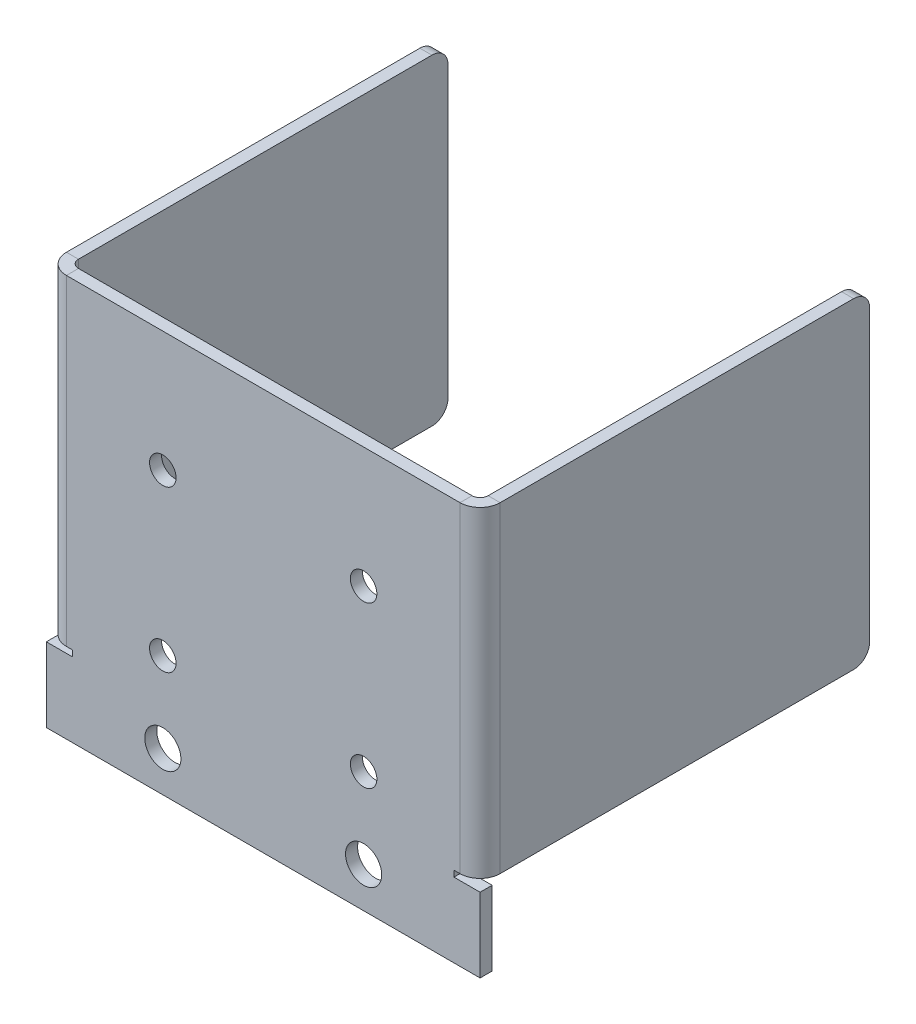
ISO-10303-21;
HEADER;
FILE_DESCRIPTION(('STEP AP214'),'2;1');
FILE_NAME('part.step','',(''),(''),'','','');
FILE_SCHEMA(('AUTOMOTIVE_DESIGN { 1 0 10303 214 1 1 1 1 }'));
ENDSEC;
DATA;
#1=APPLICATION_CONTEXT('core data for automotive mechanical design processes');
#2=APPLICATION_PROTOCOL_DEFINITION('international standard','automotive_design',2000,#1);
#3=PRODUCT_CONTEXT('',#1,'mechanical');
#4=PRODUCT('Part','Part','',(#3));
#5=PRODUCT_RELATED_PRODUCT_CATEGORY('part','',(#4));
#6=PRODUCT_DEFINITION_FORMATION('','',#4);
#7=PRODUCT_DEFINITION_CONTEXT('part definition',#1,'design');
#8=PRODUCT_DEFINITION('design','',#6,#7);
#9=PRODUCT_DEFINITION_SHAPE('','',#8);
#10=(LENGTH_UNIT() NAMED_UNIT(*) SI_UNIT(.MILLI.,.METRE.));
#11=(NAMED_UNIT(*) PLANE_ANGLE_UNIT() SI_UNIT($,.RADIAN.));
#12=(NAMED_UNIT(*) SI_UNIT($,.STERADIAN.) SOLID_ANGLE_UNIT());
#13=UNCERTAINTY_MEASURE_WITH_UNIT(LENGTH_MEASURE(1.E-05),#10,'distance_accuracy_value','');
#14=(GEOMETRIC_REPRESENTATION_CONTEXT(3) GLOBAL_UNCERTAINTY_ASSIGNED_CONTEXT((#13)) GLOBAL_UNIT_ASSIGNED_CONTEXT((#10,
#11,#12)) REPRESENTATION_CONTEXT('',''));
#15=CARTESIAN_POINT('',(0.,0.,0.));
#16=DIRECTION('',(0.,0.,1.));
#17=DIRECTION('',(1.,0.,0.));
#18=AXIS2_PLACEMENT_3D('',#15,#16,#17);
#19=CARTESIAN_POINT('',(0.,0.,0.));
#20=DIRECTION('',(0.,0.,-1.));
#21=DIRECTION('',(-1.,0.,0.));
#22=AXIS2_PLACEMENT_3D('',#19,#20,#21);
#23=PLANE('',#22);
#24=CARTESIAN_POINT('',(-12.5,-20.,0.));
#25=DIRECTION('',(0.,0.,1.));
#26=DIRECTION('',(1.,0.,0.));
#27=AXIS2_PLACEMENT_3D('',#24,#25,#26);
#28=CIRCLE('',#27,2.24999999999999);
#29=CARTESIAN_POINT('',(-10.25,-20.,0.));
#30=VERTEX_POINT('',#29);
#31=EDGE_CURVE('E487',#30,#30,#28,.T.);
#32=ORIENTED_EDGE('',*,*,#31,.F.);
#33=EDGE_LOOP('',(#32));
#34=FACE_BOUND('',#33,.T.);
#35=CARTESIAN_POINT('',(12.5,-20.,0.));
#36=DIRECTION('',(0.,0.,1.));
#37=DIRECTION('',(1.,0.,0.));
#38=AXIS2_PLACEMENT_3D('',#35,#36,#37);
#39=CIRCLE('',#38,2.24999999999999);
#40=CARTESIAN_POINT('',(14.75,-20.,0.));
#41=VERTEX_POINT('',#40);
#42=EDGE_CURVE('E481',#41,#41,#39,.T.);
#43=ORIENTED_EDGE('',*,*,#42,.F.);
#44=EDGE_LOOP('',(#43));
#45=FACE_BOUND('',#44,.T.);
#46=DIRECTION('',(0.,1.,0.));
#47=VECTOR('',#46,1.);
#48=CARTESIAN_POINT('',(-24.5,25.,0.));
#49=LINE('',#48,#47);
#50=CARTESIAN_POINT('',(-24.5,25.,0.));
#51=VERTEX_POINT('',#50);
#52=CARTESIAN_POINT('',(-24.5,-15.,0.));
#53=VERTEX_POINT('',#52);
#54=EDGE_CURVE('E262',#51,#53,#49,.F.);
#55=ORIENTED_EDGE('',*,*,#54,.T.);
#56=DIRECTION('',(-1.,0.,0.));
#57=VECTOR('',#56,1.);
#58=CARTESIAN_POINT('',(0.,-15.,0.));
#59=LINE('',#58,#57);
#60=CARTESIAN_POINT('',(-23.75,-15.,0.));
#61=VERTEX_POINT('',#60);
#62=EDGE_CURVE('E426',#61,#53,#59,.T.);
#63=ORIENTED_EDGE('',*,*,#62,.F.);
#64=DIRECTION('',(0.,1.,0.));
#65=VECTOR('',#64,1.);
#66=CARTESIAN_POINT('',(-23.75,0.,0.));
#67=LINE('',#66,#65);
#68=CARTESIAN_POINT('',(-23.75,-15.75,0.));
#69=VERTEX_POINT('',#68);
#70=EDGE_CURVE('E424',#69,#61,#67,.T.);
#71=ORIENTED_EDGE('',*,*,#70,.F.);
#72=DIRECTION('',(1.,0.,0.));
#73=VECTOR('',#72,1.);
#74=CARTESIAN_POINT('',(0.,-15.75,0.));
#75=LINE('',#74,#73);
#76=CARTESIAN_POINT('',(-27.,-15.75,0.));
#77=VERTEX_POINT('',#76);
#78=EDGE_CURVE('E358',#77,#69,#75,.T.);
#79=ORIENTED_EDGE('',*,*,#78,.F.);
#80=DIRECTION('',(0.,-1.,0.));
#81=VECTOR('',#80,1.);
#82=CARTESIAN_POINT('',(-27.,-25.,0.));
#83=LINE('',#82,#81);
#84=CARTESIAN_POINT('',(-27.,-25.,0.));
#85=VERTEX_POINT('',#84);
#86=EDGE_CURVE('E407',#77,#85,#83,.T.);
#87=ORIENTED_EDGE('',*,*,#86,.T.);
#88=DIRECTION('',(1.,0.,0.));
#89=VECTOR('',#88,1.);
#90=CARTESIAN_POINT('',(-27.,-25.,0.));
#91=LINE('',#90,#89);
#92=CARTESIAN_POINT('',(27.,-25.,0.));
#93=VERTEX_POINT('',#92);
#94=EDGE_CURVE('E394',#85,#93,#91,.T.);
#95=ORIENTED_EDGE('',*,*,#94,.T.);
#96=DIRECTION('',(0.,1.,0.));
#97=VECTOR('',#96,1.);
#98=CARTESIAN_POINT('',(27.,-25.,0.));
#99=LINE('',#98,#97);
#100=CARTESIAN_POINT('',(27.,-15.75,0.));
#101=VERTEX_POINT('',#100);
#102=EDGE_CURVE('E376',#93,#101,#99,.T.);
#103=ORIENTED_EDGE('',*,*,#102,.T.);
#104=DIRECTION('',(1.,0.,0.));
#105=VECTOR('',#104,1.);
#106=CARTESIAN_POINT('',(0.,-15.75,0.));
#107=LINE('',#106,#105);
#108=CARTESIAN_POINT('',(23.75,-15.75,0.));
#109=VERTEX_POINT('',#108);
#110=EDGE_CURVE('E421',#109,#101,#107,.T.);
#111=ORIENTED_EDGE('',*,*,#110,.F.);
#112=DIRECTION('',(0.,-1.,0.));
#113=VECTOR('',#112,1.);
#114=CARTESIAN_POINT('',(23.75,0.,0.));
#115=LINE('',#114,#113);
#116=CARTESIAN_POINT('',(23.75,-15.,0.));
#117=VERTEX_POINT('',#116);
#118=EDGE_CURVE('E418',#117,#109,#115,.T.);
#119=ORIENTED_EDGE('',*,*,#118,.F.);
#120=DIRECTION('',(-1.,0.,0.));
#121=VECTOR('',#120,1.);
#122=CARTESIAN_POINT('',(0.,-15.,0.));
#123=LINE('',#122,#121);
#124=CARTESIAN_POINT('',(24.5,-15.,0.));
#125=VERTEX_POINT('',#124);
#126=EDGE_CURVE('E413',#125,#117,#123,.T.);
#127=ORIENTED_EDGE('',*,*,#126,.F.);
#128=DIRECTION('',(0.,-1.,0.));
#129=VECTOR('',#128,1.);
#130=CARTESIAN_POINT('',(24.5,-15.,0.));
#131=LINE('',#130,#129);
#132=CARTESIAN_POINT('',(24.5,25.,0.));
#133=VERTEX_POINT('',#132);
#134=EDGE_CURVE('E333',#125,#133,#131,.F.);
#135=ORIENTED_EDGE('',*,*,#134,.T.);
#136=DIRECTION('',(-1.,0.,0.));
#137=VECTOR('',#136,1.);
#138=CARTESIAN_POINT('',(-27.,25.,0.));
#139=LINE('',#138,#137);
#140=EDGE_CURVE('E405',#133,#51,#139,.T.);
#141=ORIENTED_EDGE('',*,*,#140,.T.);
#142=EDGE_LOOP('',(#55,#63,#71,#79,#87,#95,#103,#111,#119,#127,#135,#141));
#143=FACE_BOUND('',#142,.T.);
#144=CARTESIAN_POINT('',(-12.5,10.,0.));
#145=DIRECTION('',(0.,0.,-1.));
#146=DIRECTION('',(-1.,0.,0.));
#147=AXIS2_PLACEMENT_3D('',#144,#145,#146);
#148=CIRCLE('',#147,1.65);
#149=CARTESIAN_POINT('',(-14.15,10.,0.));
#150=VERTEX_POINT('',#149);
#151=EDGE_CURVE('E490',#150,#150,#148,.T.);
#152=ORIENTED_EDGE('',*,*,#151,.T.);
#153=EDGE_LOOP('',(#152));
#154=FACE_BOUND('',#153,.T.);
#155=CARTESIAN_POINT('',(12.5,10.,0.));
#156=DIRECTION('',(0.,0.,-1.));
#157=DIRECTION('',(-1.,0.,0.));
#158=AXIS2_PLACEMENT_3D('',#155,#156,#157);
#159=CIRCLE('',#158,1.65);
#160=CARTESIAN_POINT('',(10.85,10.,0.));
#161=VERTEX_POINT('',#160);
#162=EDGE_CURVE('E496',#161,#161,#159,.T.);
#163=ORIENTED_EDGE('',*,*,#162,.T.);
#164=EDGE_LOOP('',(#163));
#165=FACE_BOUND('',#164,.T.);
#166=CARTESIAN_POINT('',(12.5,-9.99999999999999,0.));
#167=DIRECTION('',(0.,0.,1.));
#168=DIRECTION('',(1.,0.,0.));
#169=AXIS2_PLACEMENT_3D('',#166,#167,#168);
#170=CIRCLE('',#169,1.64999999999999);
#171=CARTESIAN_POINT('',(14.15,-9.99999999999999,0.));
#172=VERTEX_POINT('',#171);
#173=EDGE_CURVE('E505',#172,#172,#170,.T.);
#174=ORIENTED_EDGE('',*,*,#173,.F.);
#175=EDGE_LOOP('',(#174));
#176=FACE_BOUND('',#175,.T.);
#177=CARTESIAN_POINT('',(-12.5,-9.99999999999999,0.));
#178=DIRECTION('',(0.,0.,1.));
#179=DIRECTION('',(1.,0.,0.));
#180=AXIS2_PLACEMENT_3D('',#177,#178,#179);
#181=CIRCLE('',#180,1.64999999999999);
#182=CARTESIAN_POINT('',(-10.85,-9.99999999999999,0.));
#183=VERTEX_POINT('',#182);
#184=EDGE_CURVE('E511',#183,#183,#181,.T.);
#185=ORIENTED_EDGE('',*,*,#184,.F.);
#186=EDGE_LOOP('',(#185));
#187=FACE_BOUND('',#186,.T.);
#188=ADVANCED_FACE('F85',(#34,#45,#143,#154,#165,#176,#187),#23,.F.);
#189=CARTESIAN_POINT('',(0.,0.,-1.5));
#190=DIRECTION('',(0.,0.,-1.));
#191=DIRECTION('',(-1.,0.,0.));
#192=AXIS2_PLACEMENT_3D('',#189,#190,#191);
#193=PLANE('',#192);
#194=CARTESIAN_POINT('',(-12.5,-9.99999999999999,-1.5));
#195=DIRECTION('',(0.,0.,-1.));
#196=DIRECTION('',(-1.,0.,0.));
#197=AXIS2_PLACEMENT_3D('',#194,#195,#196);
#198=CIRCLE('',#197,1.64999999999999);
#199=CARTESIAN_POINT('',(-14.15,-9.99999999999999,-1.5));
#200=VERTEX_POINT('',#199);
#201=EDGE_CURVE('E508',#200,#200,#198,.T.);
#202=ORIENTED_EDGE('',*,*,#201,.F.);
#203=EDGE_LOOP('',(#202));
#204=FACE_BOUND('',#203,.T.);
#205=CARTESIAN_POINT('',(12.5,-9.99999999999999,-1.5));
#206=DIRECTION('',(0.,0.,-1.));
#207=DIRECTION('',(-1.,0.,0.));
#208=AXIS2_PLACEMENT_3D('',#205,#206,#207);
#209=CIRCLE('',#208,1.64999999999999);
#210=CARTESIAN_POINT('',(10.85,-9.99999999999999,-1.5));
#211=VERTEX_POINT('',#210);
#212=EDGE_CURVE('E502',#211,#211,#209,.T.);
#213=ORIENTED_EDGE('',*,*,#212,.F.);
#214=EDGE_LOOP('',(#213));
#215=FACE_BOUND('',#214,.T.);
#216=CARTESIAN_POINT('',(12.5,10.,-1.5));
#217=DIRECTION('',(0.,0.,-1.));
#218=DIRECTION('',(-1.,0.,0.));
#219=AXIS2_PLACEMENT_3D('',#216,#217,#218);
#220=CIRCLE('',#219,1.64999999999999);
#221=CARTESIAN_POINT('',(10.85,10.,-1.5));
#222=VERTEX_POINT('',#221);
#223=EDGE_CURVE('E499',#222,#222,#220,.T.);
#224=ORIENTED_EDGE('',*,*,#223,.F.);
#225=EDGE_LOOP('',(#224));
#226=FACE_BOUND('',#225,.T.);
#227=CARTESIAN_POINT('',(-12.5,10.,-1.5));
#228=DIRECTION('',(0.,0.,-1.));
#229=DIRECTION('',(-1.,0.,0.));
#230=AXIS2_PLACEMENT_3D('',#227,#228,#229);
#231=CIRCLE('',#230,1.64999999999999);
#232=CARTESIAN_POINT('',(-14.15,10.,-1.5));
#233=VERTEX_POINT('',#232);
#234=EDGE_CURVE('E493',#233,#233,#231,.T.);
#235=ORIENTED_EDGE('',*,*,#234,.F.);
#236=EDGE_LOOP('',(#235));
#237=FACE_BOUND('',#236,.T.);
#238=CARTESIAN_POINT('',(-12.5,-20.,-1.5));
#239=DIRECTION('',(0.,0.,-1.));
#240=DIRECTION('',(-1.,0.,0.));
#241=AXIS2_PLACEMENT_3D('',#238,#239,#240);
#242=CIRCLE('',#241,2.24999999999999);
#243=CARTESIAN_POINT('',(-14.75,-20.,-1.5));
#244=VERTEX_POINT('',#243);
#245=EDGE_CURVE('E484',#244,#244,#242,.T.);
#246=ORIENTED_EDGE('',*,*,#245,.F.);
#247=EDGE_LOOP('',(#246));
#248=FACE_BOUND('',#247,.T.);
#249=CARTESIAN_POINT('',(12.5,-20.,-1.5));
#250=DIRECTION('',(0.,0.,-1.));
#251=DIRECTION('',(-1.,0.,0.));
#252=AXIS2_PLACEMENT_3D('',#249,#250,#251);
#253=CIRCLE('',#252,2.24999999999999);
#254=CARTESIAN_POINT('',(10.25,-20.,-1.5));
#255=VERTEX_POINT('',#254);
#256=EDGE_CURVE('E288',#255,#255,#253,.T.);
#257=ORIENTED_EDGE('',*,*,#256,.F.);
#258=EDGE_LOOP('',(#257));
#259=FACE_BOUND('',#258,.T.);
#260=DIRECTION('',(1.,0.,0.));
#261=VECTOR('',#260,1.);
#262=CARTESIAN_POINT('',(-24.5,-15.,-1.5));
#263=LINE('',#262,#261);
#264=CARTESIAN_POINT('',(-24.5,-15.,-1.5));
#265=VERTEX_POINT('',#264);
#266=CARTESIAN_POINT('',(-23.75,-15.,-1.5));
#267=VERTEX_POINT('',#266);
#268=EDGE_CURVE('E355',#265,#267,#263,.T.);
#269=ORIENTED_EDGE('',*,*,#268,.F.);
#270=DIRECTION('',(0.,1.,0.));
#271=VECTOR('',#270,1.);
#272=CARTESIAN_POINT('',(-24.5,25.,-1.5));
#273=LINE('',#272,#271);
#274=CARTESIAN_POINT('',(-24.5,25.,-1.5));
#275=VERTEX_POINT('',#274);
#276=EDGE_CURVE('E295',#275,#265,#273,.F.);
#277=ORIENTED_EDGE('',*,*,#276,.F.);
#278=DIRECTION('',(-1.,0.,0.));
#279=VECTOR('',#278,1.);
#280=CARTESIAN_POINT('',(-27.,25.,-1.5));
#281=LINE('',#280,#279);
#282=CARTESIAN_POINT('',(24.5,25.,-1.5));
#283=VERTEX_POINT('',#282);
#284=EDGE_CURVE('E393',#283,#275,#281,.T.);
#285=ORIENTED_EDGE('',*,*,#284,.F.);
#286=DIRECTION('',(0.,-1.,0.));
#287=VECTOR('',#286,1.);
#288=CARTESIAN_POINT('',(24.5,-15.,-1.5));
#289=LINE('',#288,#287);
#290=CARTESIAN_POINT('',(24.5,-15.,-1.5));
#291=VERTEX_POINT('',#290);
#292=EDGE_CURVE('E345',#291,#283,#289,.F.);
#293=ORIENTED_EDGE('',*,*,#292,.F.);
#294=DIRECTION('',(1.,0.,0.));
#295=VECTOR('',#294,1.);
#296=CARTESIAN_POINT('',(23.75,-15.,-1.5));
#297=LINE('',#296,#295);
#298=CARTESIAN_POINT('',(23.75,-15.,-1.5));
#299=VERTEX_POINT('',#298);
#300=EDGE_CURVE('E382',#299,#291,#297,.T.);
#301=ORIENTED_EDGE('',*,*,#300,.F.);
#302=DIRECTION('',(0.,1.,0.));
#303=VECTOR('',#302,1.);
#304=CARTESIAN_POINT('',(23.75,-15.75,-1.5));
#305=LINE('',#304,#303);
#306=CARTESIAN_POINT('',(23.75,-15.75,-1.5));
#307=VERTEX_POINT('',#306);
#308=EDGE_CURVE('E378',#307,#299,#305,.T.);
#309=ORIENTED_EDGE('',*,*,#308,.F.);
#310=DIRECTION('',(-1.,0.,0.));
#311=VECTOR('',#310,1.);
#312=CARTESIAN_POINT('',(27.,-15.75,-1.5));
#313=LINE('',#312,#311);
#314=CARTESIAN_POINT('',(27.,-15.75,-1.5));
#315=VERTEX_POINT('',#314);
#316=EDGE_CURVE('E373',#315,#307,#313,.T.);
#317=ORIENTED_EDGE('',*,*,#316,.F.);
#318=DIRECTION('',(0.,1.,0.));
#319=VECTOR('',#318,1.);
#320=CARTESIAN_POINT('',(27.,-25.,-1.5));
#321=LINE('',#320,#319);
#322=CARTESIAN_POINT('',(27.,-25.,-1.5));
#323=VERTEX_POINT('',#322);
#324=EDGE_CURVE('E390',#323,#315,#321,.T.);
#325=ORIENTED_EDGE('',*,*,#324,.F.);
#326=DIRECTION('',(1.,0.,0.));
#327=VECTOR('',#326,1.);
#328=CARTESIAN_POINT('',(-27.,-25.,-1.5));
#329=LINE('',#328,#327);
#330=CARTESIAN_POINT('',(-27.,-25.,-1.5));
#331=VERTEX_POINT('',#330);
#332=EDGE_CURVE('E399',#331,#323,#329,.T.);
#333=ORIENTED_EDGE('',*,*,#332,.F.);
#334=DIRECTION('',(0.,-1.,0.));
#335=VECTOR('',#334,1.);
#336=CARTESIAN_POINT('',(-27.,-25.,-1.5));
#337=LINE('',#336,#335);
#338=CARTESIAN_POINT('',(-27.,-15.75,-1.5));
#339=VERTEX_POINT('',#338);
#340=EDGE_CURVE('E397',#339,#331,#337,.T.);
#341=ORIENTED_EDGE('',*,*,#340,.F.);
#342=DIRECTION('',(-1.,0.,0.));
#343=VECTOR('',#342,1.);
#344=CARTESIAN_POINT('',(-23.75,-15.75,-1.5));
#345=LINE('',#344,#343);
#346=CARTESIAN_POINT('',(-23.75,-15.75,-1.5));
#347=VERTEX_POINT('',#346);
#348=EDGE_CURVE('E363',#347,#339,#345,.T.);
#349=ORIENTED_EDGE('',*,*,#348,.F.);
#350=DIRECTION('',(0.,-1.,0.));
#351=VECTOR('',#350,1.);
#352=CARTESIAN_POINT('',(-23.75,-15.,-1.5));
#353=LINE('',#352,#351);
#354=EDGE_CURVE('E359',#267,#347,#353,.T.);
#355=ORIENTED_EDGE('',*,*,#354,.F.);
#356=EDGE_LOOP('',(#269,#277,#285,#293,#301,#309,#317,#325,#333,#341,#349,#355));
#357=FACE_BOUND('',#356,.T.);
#358=ADVANCED_FACE('F519',(#204,#215,#226,#237,#248,#259,#357),#193,.T.);
#359=CARTESIAN_POINT('',(-27.,-25.,-1.5));
#360=DIRECTION('',(-1.,0.,0.));
#361=DIRECTION('',(0.,0.,1.));
#362=AXIS2_PLACEMENT_3D('',#359,#360,#361);
#363=PLANE('',#362);
#364=ORIENTED_EDGE('',*,*,#86,.F.);
#365=DIRECTION('',(0.,0.,1.));
#366=VECTOR('',#365,1.);
#367=CARTESIAN_POINT('',(-27.,-15.75,-1.5));
#368=LINE('',#367,#366);
#369=EDGE_CURVE('E365',#339,#77,#368,.T.);
#370=ORIENTED_EDGE('',*,*,#369,.F.);
#371=ORIENTED_EDGE('',*,*,#340,.T.);
#372=DIRECTION('',(0.,0.,1.));
#373=VECTOR('',#372,1.);
#374=CARTESIAN_POINT('',(-27.,-25.,-1.5));
#375=LINE('',#374,#373);
#376=EDGE_CURVE('E402',#331,#85,#375,.T.);
#377=ORIENTED_EDGE('',*,*,#376,.T.);
#378=EDGE_LOOP('',(#364,#370,#371,#377));
#379=FACE_BOUND('',#378,.T.);
#380=ADVANCED_FACE('F525',(#379),#363,.T.);
#381=CARTESIAN_POINT('',(-27.,25.,-1.5));
#382=DIRECTION('',(0.,1.,0.));
#383=DIRECTION('',(0.,0.,1.));
#384=AXIS2_PLACEMENT_3D('',#381,#382,#383);
#385=PLANE('',#384);
#386=ORIENTED_EDGE('',*,*,#284,.T.);
#387=DIRECTION('',(0.,0.,1.));
#388=VECTOR('',#387,1.);
#389=CARTESIAN_POINT('',(-24.5,25.,-1.5));
#390=LINE('',#389,#388);
#391=EDGE_CURVE('E291',#275,#51,#390,.T.);
#392=ORIENTED_EDGE('',*,*,#391,.T.);
#393=ORIENTED_EDGE('',*,*,#140,.F.);
#394=DIRECTION('',(0.,0.,1.));
#395=VECTOR('',#394,1.);
#396=CARTESIAN_POINT('',(24.5,25.,-1.5));
#397=LINE('',#396,#395);
#398=EDGE_CURVE('E350',#283,#133,#397,.T.);
#399=ORIENTED_EDGE('',*,*,#398,.F.);
#400=EDGE_LOOP('',(#386,#392,#393,#399));
#401=FACE_BOUND('',#400,.T.);
#402=ADVANCED_FACE('F540',(#401),#385,.T.);
#403=CARTESIAN_POINT('',(27.,-25.,-1.5));
#404=DIRECTION('',(1.,0.,0.));
#405=DIRECTION('',(0.,0.,-1.));
#406=AXIS2_PLACEMENT_3D('',#403,#404,#405);
#407=PLANE('',#406);
#408=ORIENTED_EDGE('',*,*,#324,.T.);
#409=DIRECTION('',(0.,0.,1.));
#410=VECTOR('',#409,1.);
#411=CARTESIAN_POINT('',(27.,-15.75,-1.5));
#412=LINE('',#411,#410);
#413=EDGE_CURVE('E377',#315,#101,#412,.T.);
#414=ORIENTED_EDGE('',*,*,#413,.T.);
#415=ORIENTED_EDGE('',*,*,#102,.F.);
#416=DIRECTION('',(0.,0.,1.));
#417=VECTOR('',#416,1.);
#418=CARTESIAN_POINT('',(27.,-25.,-1.5));
#419=LINE('',#418,#417);
#420=EDGE_CURVE('E411',#323,#93,#419,.T.);
#421=ORIENTED_EDGE('',*,*,#420,.F.);
#422=EDGE_LOOP('',(#408,#414,#415,#421));
#423=FACE_BOUND('',#422,.T.);
#424=ADVANCED_FACE('F536',(#423),#407,.T.);
#425=CARTESIAN_POINT('',(-27.,-25.,-1.5));
#426=DIRECTION('',(0.,-1.,0.));
#427=DIRECTION('',(0.,0.,-1.));
#428=AXIS2_PLACEMENT_3D('',#425,#426,#427);
#429=PLANE('',#428);
#430=ORIENTED_EDGE('',*,*,#94,.F.);
#431=ORIENTED_EDGE('',*,*,#376,.F.);
#432=ORIENTED_EDGE('',*,*,#332,.T.);
#433=ORIENTED_EDGE('',*,*,#420,.T.);
#434=EDGE_LOOP('',(#430,#431,#432,#433));
#435=FACE_BOUND('',#434,.T.);
#436=ADVANCED_FACE('F532',(#435),#429,.T.);
#437=CARTESIAN_POINT('',(27.,-15.75,-1.5));
#438=DIRECTION('',(0.,1.,0.));
#439=DIRECTION('',(0.,0.,1.));
#440=AXIS2_PLACEMENT_3D('',#437,#438,#439);
#441=PLANE('',#440);
#442=DIRECTION('',(0.,0.,1.));
#443=VECTOR('',#442,1.);
#444=CARTESIAN_POINT('',(23.75,-15.75,-1.5));
#445=LINE('',#444,#443);
#446=EDGE_CURVE('E381',#307,#109,#445,.T.);
#447=ORIENTED_EDGE('',*,*,#446,.T.);
#448=ORIENTED_EDGE('',*,*,#110,.T.);
#449=ORIENTED_EDGE('',*,*,#413,.F.);
#450=ORIENTED_EDGE('',*,*,#316,.T.);
#451=EDGE_LOOP('',(#447,#448,#449,#450));
#452=FACE_BOUND('',#451,.T.);
#453=ADVANCED_FACE('F535',(#452),#441,.T.);
#454=CARTESIAN_POINT('',(23.75,-15.75,-1.5));
#455=DIRECTION('',(1.,0.,0.));
#456=DIRECTION('',(0.,0.,-1.));
#457=AXIS2_PLACEMENT_3D('',#454,#455,#456);
#458=PLANE('',#457);
#459=DIRECTION('',(0.,0.,1.));
#460=VECTOR('',#459,1.);
#461=CARTESIAN_POINT('',(23.75,-15.,-1.5));
#462=LINE('',#461,#460);
#463=EDGE_CURVE('E372',#299,#117,#462,.T.);
#464=ORIENTED_EDGE('',*,*,#463,.T.);
#465=ORIENTED_EDGE('',*,*,#118,.T.);
#466=ORIENTED_EDGE('',*,*,#446,.F.);
#467=ORIENTED_EDGE('',*,*,#308,.T.);
#468=EDGE_LOOP('',(#464,#465,#466,#467));
#469=FACE_BOUND('',#468,.T.);
#470=ADVANCED_FACE('F643',(#469),#458,.T.);
#471=CARTESIAN_POINT('',(23.75,-15.,-1.5));
#472=DIRECTION('',(0.,-1.,0.));
#473=DIRECTION('',(0.,0.,-1.));
#474=AXIS2_PLACEMENT_3D('',#471,#472,#473);
#475=PLANE('',#474);
#476=DIRECTION('',(0.,0.,1.));
#477=VECTOR('',#476,1.);
#478=CARTESIAN_POINT('',(24.5,-15.,-1.5));
#479=LINE('',#478,#477);
#480=EDGE_CURVE('E339',#291,#125,#479,.T.);
#481=ORIENTED_EDGE('',*,*,#480,.T.);
#482=ORIENTED_EDGE('',*,*,#126,.T.);
#483=ORIENTED_EDGE('',*,*,#463,.F.);
#484=ORIENTED_EDGE('',*,*,#300,.T.);
#485=EDGE_LOOP('',(#481,#482,#483,#484));
#486=FACE_BOUND('',#485,.T.);
#487=ADVANCED_FACE('F640',(#486),#475,.T.);
#488=CARTESIAN_POINT('',(-24.5,-15.,-1.5));
#489=DIRECTION('',(0.,-1.,0.));
#490=DIRECTION('',(0.,0.,-1.));
#491=AXIS2_PLACEMENT_3D('',#488,#489,#490);
#492=PLANE('',#491);
#493=DIRECTION('',(0.,0.,1.));
#494=VECTOR('',#493,1.);
#495=CARTESIAN_POINT('',(-23.75,-15.,-1.5));
#496=LINE('',#495,#494);
#497=EDGE_CURVE('E362',#267,#61,#496,.T.);
#498=ORIENTED_EDGE('',*,*,#497,.T.);
#499=ORIENTED_EDGE('',*,*,#62,.T.);
#500=DIRECTION('',(0.,0.,1.));
#501=VECTOR('',#500,1.);
#502=CARTESIAN_POINT('',(-24.5,-15.,-1.5));
#503=LINE('',#502,#501);
#504=EDGE_CURVE('E299',#265,#53,#503,.T.);
#505=ORIENTED_EDGE('',*,*,#504,.F.);
#506=ORIENTED_EDGE('',*,*,#268,.T.);
#507=EDGE_LOOP('',(#498,#499,#505,#506));
#508=FACE_BOUND('',#507,.T.);
#509=ADVANCED_FACE('F569',(#508),#492,.T.);
#510=CARTESIAN_POINT('',(-23.75,-15.,-1.5));
#511=DIRECTION('',(-1.,0.,0.));
#512=DIRECTION('',(0.,0.,1.));
#513=AXIS2_PLACEMENT_3D('',#510,#511,#512);
#514=PLANE('',#513);
#515=DIRECTION('',(0.,0.,1.));
#516=VECTOR('',#515,1.);
#517=CARTESIAN_POINT('',(-23.75,-15.75,-1.5));
#518=LINE('',#517,#516);
#519=EDGE_CURVE('E353',#347,#69,#518,.T.);
#520=ORIENTED_EDGE('',*,*,#519,.T.);
#521=ORIENTED_EDGE('',*,*,#70,.T.);
#522=ORIENTED_EDGE('',*,*,#497,.F.);
#523=ORIENTED_EDGE('',*,*,#354,.T.);
#524=EDGE_LOOP('',(#520,#521,#522,#523));
#525=FACE_BOUND('',#524,.T.);
#526=ADVANCED_FACE('F577',(#525),#514,.T.);
#527=CARTESIAN_POINT('',(-23.75,-15.75,-1.5));
#528=DIRECTION('',(0.,1.,0.));
#529=DIRECTION('',(0.,0.,1.));
#530=AXIS2_PLACEMENT_3D('',#527,#528,#529);
#531=PLANE('',#530);
#532=ORIENTED_EDGE('',*,*,#369,.T.);
#533=ORIENTED_EDGE('',*,*,#78,.T.);
#534=ORIENTED_EDGE('',*,*,#519,.F.);
#535=ORIENTED_EDGE('',*,*,#348,.T.);
#536=EDGE_LOOP('',(#532,#533,#534,#535));
#537=FACE_BOUND('',#536,.T.);
#538=ADVANCED_FACE('F631',(#537),#531,.T.);
#539=CARTESIAN_POINT('',(24.5,25.,-2.5));
#540=DIRECTION('',(0.,1.,0.));
#541=DIRECTION('',(0.,0.,1.));
#542=AXIS2_PLACEMENT_3D('',#539,#540,#541);
#543=PLANE('',#542);
#544=DIRECTION('',(1.,0.,0.));
#545=VECTOR('',#544,1.);
#546=CARTESIAN_POINT('',(27.,25.,-2.49999999999999));
#547=LINE('',#546,#545);
#548=CARTESIAN_POINT('',(25.5,25.,-2.5));
#549=VERTEX_POINT('',#548);
#550=CARTESIAN_POINT('',(27.,25.,-2.49999999999999));
#551=VERTEX_POINT('',#550);
#552=EDGE_CURVE('E302',#549,#551,#547,.T.);
#553=ORIENTED_EDGE('',*,*,#552,.F.);
#554=CARTESIAN_POINT('',(24.5,25.,-2.5));
#555=DIRECTION('',(0.,-1.,0.));
#556=DIRECTION('',(0.,0.,-1.));
#557=AXIS2_PLACEMENT_3D('',#554,#555,#556);
#558=CIRCLE('',#557,1.);
#559=EDGE_CURVE('E342',#283,#549,#558,.F.);
#560=ORIENTED_EDGE('',*,*,#559,.F.);
#561=ORIENTED_EDGE('',*,*,#398,.T.);
#562=CARTESIAN_POINT('',(24.5,25.,-2.5));
#563=DIRECTION('',(0.,-1.,0.));
#564=DIRECTION('',(0.,0.,-1.));
#565=AXIS2_PLACEMENT_3D('',#562,#563,#564);
#566=CIRCLE('',#565,2.5);
#567=EDGE_CURVE('E335',#133,#551,#566,.F.);
#568=ORIENTED_EDGE('',*,*,#567,.T.);
#569=EDGE_LOOP('',(#553,#560,#561,#568));
#570=FACE_BOUND('',#569,.T.);
#571=ADVANCED_FACE('F591',(#570),#543,.T.);
#572=CARTESIAN_POINT('',(24.5,-15.,-2.5));
#573=DIRECTION('',(0.,1.,0.));
#574=DIRECTION('',(0.,0.,1.));
#575=AXIS2_PLACEMENT_3D('',#572,#573,#574);
#576=PLANE('',#575);
#577=CARTESIAN_POINT('',(24.5,-15.,-2.5));
#578=DIRECTION('',(0.,-1.,0.));
#579=DIRECTION('',(0.,0.,-1.));
#580=AXIS2_PLACEMENT_3D('',#577,#578,#579);
#581=CIRCLE('',#580,1.);
#582=CARTESIAN_POINT('',(25.5,-15.,-2.5));
#583=VERTEX_POINT('',#582);
#584=EDGE_CURVE('E307',#583,#291,#581,.T.);
#585=ORIENTED_EDGE('',*,*,#584,.F.);
#586=DIRECTION('',(1.,0.,0.));
#587=VECTOR('',#586,1.);
#588=CARTESIAN_POINT('',(25.5,-15.,-2.5));
#589=LINE('',#588,#587);
#590=CARTESIAN_POINT('',(27.,-15.,-2.49999999999999));
#591=VERTEX_POINT('',#590);
#592=EDGE_CURVE('E325',#583,#591,#589,.T.);
#593=ORIENTED_EDGE('',*,*,#592,.T.);
#594=CARTESIAN_POINT('',(24.5,-15.,-2.5));
#595=DIRECTION('',(0.,-1.,0.));
#596=DIRECTION('',(0.,0.,-1.));
#597=AXIS2_PLACEMENT_3D('',#594,#595,#596);
#598=CIRCLE('',#597,2.5);
#599=EDGE_CURVE('E336',#591,#125,#598,.T.);
#600=ORIENTED_EDGE('',*,*,#599,.T.);
#601=ORIENTED_EDGE('',*,*,#480,.F.);
#602=EDGE_LOOP('',(#585,#593,#600,#601));
#603=FACE_BOUND('',#602,.T.);
#604=ADVANCED_FACE('F611',(#603),#576,.F.);
#605=CARTESIAN_POINT('',(24.5,-15.,-2.5));
#606=DIRECTION('',(0.,-1.,0.));
#607=DIRECTION('',(1.,0.,0.));
#608=AXIS2_PLACEMENT_3D('',#605,#606,#607);
#609=CYLINDRICAL_SURFACE('',#608,2.5);
#610=ORIENTED_EDGE('',*,*,#134,.F.);
#611=ORIENTED_EDGE('',*,*,#599,.F.);
#612=DIRECTION('',(0.,-1.,0.));
#613=VECTOR('',#612,1.);
#614=CARTESIAN_POINT('',(27.,0.,-2.49999999999999));
#615=LINE('',#614,#613);
#616=EDGE_CURVE('E322',#551,#591,#615,.T.);
#617=ORIENTED_EDGE('',*,*,#616,.F.);
#618=ORIENTED_EDGE('',*,*,#567,.F.);
#619=EDGE_LOOP('',(#610,#611,#617,#618));
#620=FACE_BOUND('',#619,.T.);
#621=ADVANCED_FACE('F618',(#620),#609,.T.);
#622=CARTESIAN_POINT('',(24.5,-15.,-2.5));
#623=DIRECTION('',(0.,-1.,0.));
#624=DIRECTION('',(1.,0.,0.));
#625=AXIS2_PLACEMENT_3D('',#622,#623,#624);
#626=CYLINDRICAL_SURFACE('',#625,1.);
#627=ORIENTED_EDGE('',*,*,#292,.T.);
#628=ORIENTED_EDGE('',*,*,#559,.T.);
#629=DIRECTION('',(0.,1.,0.));
#630=VECTOR('',#629,1.);
#631=CARTESIAN_POINT('',(25.5,25.,-2.5));
#632=LINE('',#631,#630);
#633=EDGE_CURVE('E328',#549,#583,#632,.F.);
#634=ORIENTED_EDGE('',*,*,#633,.T.);
#635=ORIENTED_EDGE('',*,*,#584,.T.);
#636=EDGE_LOOP('',(#627,#628,#634,#635));
#637=FACE_BOUND('',#636,.T.);
#638=ADVANCED_FACE('F587',(#637),#626,.F.);
#639=CARTESIAN_POINT('',(27.,-15.,-1.49999999999999));
#640=DIRECTION('',(0.,-1.,0.));
#641=DIRECTION('',(0.,0.,-1.));
#642=AXIS2_PLACEMENT_3D('',#639,#640,#641);
#643=PLANE('',#642);
#644=DIRECTION('',(0.,0.,-1.));
#645=VECTOR('',#644,1.);
#646=CARTESIAN_POINT('',(25.5,-15.,0.));
#647=LINE('',#646,#645);
#648=CARTESIAN_POINT('',(25.5000000000002,-15.,-46.5));
#649=VERTEX_POINT('',#648);
#650=EDGE_CURVE('E314',#649,#583,#647,.F.);
#651=ORIENTED_EDGE('',*,*,#650,.F.);
#652=DIRECTION('',(-1.,0.,0.));
#653=VECTOR('',#652,1.);
#654=CARTESIAN_POINT('',(27.0000000000002,-15.,-46.5));
#655=LINE('',#654,#653);
#656=CARTESIAN_POINT('',(27.0000000000002,-15.,-46.5));
#657=VERTEX_POINT('',#656);
#658=EDGE_CURVE('E437',#649,#657,#655,.F.);
#659=ORIENTED_EDGE('',*,*,#658,.T.);
#660=DIRECTION('',(0.,0.,1.));
#661=VECTOR('',#660,1.);
#662=CARTESIAN_POINT('',(27.,-15.,-1.49999999999999));
#663=LINE('',#662,#661);
#664=EDGE_CURVE('E305',#657,#591,#663,.T.);
#665=ORIENTED_EDGE('',*,*,#664,.T.);
#666=ORIENTED_EDGE('',*,*,#592,.F.);
#667=EDGE_LOOP('',(#651,#659,#665,#666));
#668=FACE_BOUND('',#667,.T.);
#669=ADVANCED_FACE('F613',(#668),#643,.T.);
#670=CARTESIAN_POINT('',(27.0000000000002,25.,-48.5));
#671=DIRECTION('',(0.,1.,0.));
#672=DIRECTION('',(0.,0.,1.));
#673=AXIS2_PLACEMENT_3D('',#670,#671,#672);
#674=PLANE('',#673);
#675=DIRECTION('',(0.,0.,-1.));
#676=VECTOR('',#675,1.);
#677=CARTESIAN_POINT('',(27.0000000000002,25.,-48.5));
#678=LINE('',#677,#676);
#679=CARTESIAN_POINT('',(27.0000000000002,25.,-46.5));
#680=VERTEX_POINT('',#679);
#681=EDGE_CURVE('E311',#551,#680,#678,.T.);
#682=ORIENTED_EDGE('',*,*,#681,.T.);
#683=DIRECTION('',(-1.,0.,0.));
#684=VECTOR('',#683,1.);
#685=CARTESIAN_POINT('',(27.0000000000002,25.,-46.5));
#686=LINE('',#685,#684);
#687=CARTESIAN_POINT('',(25.5000000000002,25.,-46.5));
#688=VERTEX_POINT('',#687);
#689=EDGE_CURVE('E443',#680,#688,#686,.T.);
#690=ORIENTED_EDGE('',*,*,#689,.T.);
#691=DIRECTION('',(0.,0.,1.));
#692=VECTOR('',#691,1.);
#693=CARTESIAN_POINT('',(25.5,25.,0.));
#694=LINE('',#693,#692);
#695=EDGE_CURVE('E319',#549,#688,#694,.F.);
#696=ORIENTED_EDGE('',*,*,#695,.F.);
#697=ORIENTED_EDGE('',*,*,#552,.T.);
#698=EDGE_LOOP('',(#682,#690,#696,#697));
#699=FACE_BOUND('',#698,.T.);
#700=ADVANCED_FACE('F596',(#699),#674,.T.);
#701=CARTESIAN_POINT('',(27.,0.,0.));
#702=DIRECTION('',(1.,0.,0.));
#703=DIRECTION('',(0.,0.,-1.));
#704=AXIS2_PLACEMENT_3D('',#701,#702,#703);
#705=PLANE('',#704);
#706=ORIENTED_EDGE('',*,*,#664,.F.);
#707=CARTESIAN_POINT('',(27.0000000000002,-13.,-46.5));
#708=DIRECTION('',(1.,0.,0.));
#709=DIRECTION('',(0.,0.,-1.));
#710=AXIS2_PLACEMENT_3D('',#707,#708,#709);
#711=CIRCLE('',#710,2.);
#712=CARTESIAN_POINT('',(27.0000000000002,-13.,-48.5));
#713=VERTEX_POINT('',#712);
#714=EDGE_CURVE('E441',#657,#713,#711,.T.);
#715=ORIENTED_EDGE('',*,*,#714,.T.);
#716=DIRECTION('',(0.,-1.,0.));
#717=VECTOR('',#716,1.);
#718=CARTESIAN_POINT('',(27.0000000000002,-15.,-48.5));
#719=LINE('',#718,#717);
#720=CARTESIAN_POINT('',(27.0000000000002,23.,-48.5));
#721=VERTEX_POINT('',#720);
#722=EDGE_CURVE('E308',#721,#713,#719,.T.);
#723=ORIENTED_EDGE('',*,*,#722,.F.);
#724=CARTESIAN_POINT('',(27.0000000000002,23.,-46.5));
#725=DIRECTION('',(1.,0.,0.));
#726=DIRECTION('',(0.,0.,-1.));
#727=AXIS2_PLACEMENT_3D('',#724,#725,#726);
#728=CIRCLE('',#727,2.);
#729=EDGE_CURVE('E439',#721,#680,#728,.T.);
#730=ORIENTED_EDGE('',*,*,#729,.T.);
#731=ORIENTED_EDGE('',*,*,#681,.F.);
#732=ORIENTED_EDGE('',*,*,#616,.T.);
#733=EDGE_LOOP('',(#706,#715,#723,#730,#731,#732));
#734=FACE_BOUND('',#733,.T.);
#735=ADVANCED_FACE('F600',(#734),#705,.T.);
#736=CARTESIAN_POINT('',(25.5,0.,0.));
#737=DIRECTION('',(1.,0.,0.));
#738=DIRECTION('',(0.,0.,-1.));
#739=AXIS2_PLACEMENT_3D('',#736,#737,#738);
#740=PLANE('',#739);
#741=DIRECTION('',(0.,1.,0.));
#742=VECTOR('',#741,1.);
#743=CARTESIAN_POINT('',(25.5000000000002,0.,-48.5));
#744=LINE('',#743,#742);
#745=CARTESIAN_POINT('',(25.5000000000002,23.,-48.5));
#746=VERTEX_POINT('',#745);
#747=CARTESIAN_POINT('',(25.5000000000002,-13.,-48.5));
#748=VERTEX_POINT('',#747);
#749=EDGE_CURVE('E316',#746,#748,#744,.F.);
#750=ORIENTED_EDGE('',*,*,#749,.T.);
#751=CARTESIAN_POINT('',(25.5000000000002,-13.,-46.5));
#752=DIRECTION('',(1.,0.,0.));
#753=DIRECTION('',(0.,0.,-1.));
#754=AXIS2_PLACEMENT_3D('',#751,#752,#753);
#755=CIRCLE('',#754,2.);
#756=EDGE_CURVE('E435',#748,#649,#755,.F.);
#757=ORIENTED_EDGE('',*,*,#756,.T.);
#758=ORIENTED_EDGE('',*,*,#650,.T.);
#759=ORIENTED_EDGE('',*,*,#633,.F.);
#760=ORIENTED_EDGE('',*,*,#695,.T.);
#761=CARTESIAN_POINT('',(25.5000000000002,23.,-46.5));
#762=DIRECTION('',(1.,0.,0.));
#763=DIRECTION('',(0.,0.,-1.));
#764=AXIS2_PLACEMENT_3D('',#761,#762,#763);
#765=CIRCLE('',#764,2.);
#766=EDGE_CURVE('E433',#688,#746,#765,.F.);
#767=ORIENTED_EDGE('',*,*,#766,.T.);
#768=EDGE_LOOP('',(#750,#757,#758,#759,#760,#767));
#769=FACE_BOUND('',#768,.T.);
#770=ADVANCED_FACE('F605',(#769),#740,.F.);
#771=CARTESIAN_POINT('',(27.0000000000002,-15.,-48.5));
#772=DIRECTION('',(0.,0.,-1.));
#773=DIRECTION('',(-1.,0.,0.));
#774=AXIS2_PLACEMENT_3D('',#771,#772,#773);
#775=PLANE('',#774);
#776=ORIENTED_EDGE('',*,*,#722,.T.);
#777=DIRECTION('',(-1.,0.,0.));
#778=VECTOR('',#777,1.);
#779=CARTESIAN_POINT('',(27.0000000000002,-13.,-48.5));
#780=LINE('',#779,#778);
#781=EDGE_CURVE('E430',#713,#748,#780,.T.);
#782=ORIENTED_EDGE('',*,*,#781,.T.);
#783=ORIENTED_EDGE('',*,*,#749,.F.);
#784=DIRECTION('',(-1.,0.,0.));
#785=VECTOR('',#784,1.);
#786=CARTESIAN_POINT('',(27.0000000000002,23.,-48.5));
#787=LINE('',#786,#785);
#788=EDGE_CURVE('E428',#746,#721,#787,.F.);
#789=ORIENTED_EDGE('',*,*,#788,.T.);
#790=EDGE_LOOP('',(#776,#782,#783,#789));
#791=FACE_BOUND('',#790,.T.);
#792=ADVANCED_FACE('F716',(#791),#775,.T.);
#793=CARTESIAN_POINT('',(-24.5,-15.,-2.5));
#794=DIRECTION('',(0.,-1.,0.));
#795=DIRECTION('',(0.,0.,-1.));
#796=AXIS2_PLACEMENT_3D('',#793,#794,#795);
#797=PLANE('',#796);
#798=DIRECTION('',(-1.,0.,0.));
#799=VECTOR('',#798,1.);
#800=CARTESIAN_POINT('',(-27.,-15.,-2.49999999999999));
#801=LINE('',#800,#799);
#802=CARTESIAN_POINT('',(-25.5,-15.,-2.5));
#803=VERTEX_POINT('',#802);
#804=CARTESIAN_POINT('',(-27.,-15.,-2.49999999999999));
#805=VERTEX_POINT('',#804);
#806=EDGE_CURVE('E285',#803,#805,#801,.T.);
#807=ORIENTED_EDGE('',*,*,#806,.F.);
#808=CARTESIAN_POINT('',(-24.5,-15.,-2.5));
#809=DIRECTION('',(0.,1.,0.));
#810=DIRECTION('',(0.,0.,1.));
#811=AXIS2_PLACEMENT_3D('',#808,#809,#810);
#812=CIRCLE('',#811,1.);
#813=EDGE_CURVE('E265',#265,#803,#812,.F.);
#814=ORIENTED_EDGE('',*,*,#813,.F.);
#815=ORIENTED_EDGE('',*,*,#504,.T.);
#816=CARTESIAN_POINT('',(-24.5,-15.,-2.5));
#817=DIRECTION('',(0.,1.,0.));
#818=DIRECTION('',(0.,0.,1.));
#819=AXIS2_PLACEMENT_3D('',#816,#817,#818);
#820=CIRCLE('',#819,2.5);
#821=EDGE_CURVE('E290',#53,#805,#820,.F.);
#822=ORIENTED_EDGE('',*,*,#821,.T.);
#823=EDGE_LOOP('',(#807,#814,#815,#822));
#824=FACE_BOUND('',#823,.T.);
#825=ADVANCED_FACE('F566',(#824),#797,.T.);
#826=CARTESIAN_POINT('',(-24.5,25.,-2.5));
#827=DIRECTION('',(0.,-1.,0.));
#828=DIRECTION('',(0.,0.,-1.));
#829=AXIS2_PLACEMENT_3D('',#826,#827,#828);
#830=PLANE('',#829);
#831=CARTESIAN_POINT('',(-24.5,25.,-2.5));
#832=DIRECTION('',(0.,1.,0.));
#833=DIRECTION('',(0.,0.,1.));
#834=AXIS2_PLACEMENT_3D('',#831,#832,#833);
#835=CIRCLE('',#834,1.);
#836=CARTESIAN_POINT('',(-25.5,25.,-2.5));
#837=VERTEX_POINT('',#836);
#838=EDGE_CURVE('E250',#837,#275,#835,.T.);
#839=ORIENTED_EDGE('',*,*,#838,.F.);
#840=DIRECTION('',(-1.,0.,0.));
#841=VECTOR('',#840,1.);
#842=CARTESIAN_POINT('',(-25.5,25.,-2.5));
#843=LINE('',#842,#841);
#844=CARTESIAN_POINT('',(-27.,25.,-2.49999999999999));
#845=VERTEX_POINT('',#844);
#846=EDGE_CURVE('E248',#837,#845,#843,.T.);
#847=ORIENTED_EDGE('',*,*,#846,.T.);
#848=CARTESIAN_POINT('',(-24.5,25.,-2.5));
#849=DIRECTION('',(0.,1.,0.));
#850=DIRECTION('',(0.,0.,1.));
#851=AXIS2_PLACEMENT_3D('',#848,#849,#850);
#852=CIRCLE('',#851,2.5);
#853=EDGE_CURVE('E256',#845,#51,#852,.T.);
#854=ORIENTED_EDGE('',*,*,#853,.T.);
#855=ORIENTED_EDGE('',*,*,#391,.F.);
#856=EDGE_LOOP('',(#839,#847,#854,#855));
#857=FACE_BOUND('',#856,.T.);
#858=ADVANCED_FACE('F268',(#857),#830,.F.);
#859=CARTESIAN_POINT('',(-24.5,25.,-2.5));
#860=DIRECTION('',(0.,1.,0.));
#861=DIRECTION('',(-1.,0.,0.));
#862=AXIS2_PLACEMENT_3D('',#859,#860,#861);
#863=CYLINDRICAL_SURFACE('',#862,2.5);
#864=ORIENTED_EDGE('',*,*,#54,.F.);
#865=ORIENTED_EDGE('',*,*,#853,.F.);
#866=DIRECTION('',(0.,1.,0.));
#867=VECTOR('',#866,1.);
#868=CARTESIAN_POINT('',(-27.,-15.,-2.49999999999999));
#869=LINE('',#868,#867);
#870=EDGE_CURVE('E259',#845,#805,#869,.F.);
#871=ORIENTED_EDGE('',*,*,#870,.T.);
#872=ORIENTED_EDGE('',*,*,#821,.F.);
#873=EDGE_LOOP('',(#864,#865,#871,#872));
#874=FACE_BOUND('',#873,.T.);
#875=ADVANCED_FACE('F257',(#874),#863,.T.);
#876=CARTESIAN_POINT('',(-24.5,25.,-2.5));
#877=DIRECTION('',(0.,1.,0.));
#878=DIRECTION('',(-1.,0.,0.));
#879=AXIS2_PLACEMENT_3D('',#876,#877,#878);
#880=CYLINDRICAL_SURFACE('',#879,1.);
#881=ORIENTED_EDGE('',*,*,#276,.T.);
#882=ORIENTED_EDGE('',*,*,#813,.T.);
#883=DIRECTION('',(0.,1.,0.));
#884=VECTOR('',#883,1.);
#885=CARTESIAN_POINT('',(-25.5,-15.,-2.5));
#886=LINE('',#885,#884);
#887=EDGE_CURVE('E270',#803,#837,#886,.T.);
#888=ORIENTED_EDGE('',*,*,#887,.T.);
#889=ORIENTED_EDGE('',*,*,#838,.T.);
#890=EDGE_LOOP('',(#881,#882,#888,#889));
#891=FACE_BOUND('',#890,.T.);
#892=ADVANCED_FACE('F563',(#891),#880,.F.);
#893=CARTESIAN_POINT('',(-27.,-15.,-1.49999999999999));
#894=DIRECTION('',(0.,-1.,0.));
#895=DIRECTION('',(0.,0.,-1.));
#896=AXIS2_PLACEMENT_3D('',#893,#894,#895);
#897=PLANE('',#896);
#898=DIRECTION('',(0.,0.,1.));
#899=VECTOR('',#898,1.);
#900=CARTESIAN_POINT('',(-27.,-15.,-1.49999999999999));
#901=LINE('',#900,#899);
#902=CARTESIAN_POINT('',(-27.0000000000002,-15.,-46.5));
#903=VERTEX_POINT('',#902);
#904=EDGE_CURVE('E275',#805,#903,#901,.F.);
#905=ORIENTED_EDGE('',*,*,#904,.T.);
#906=DIRECTION('',(1.,0.,0.));
#907=VECTOR('',#906,1.);
#908=CARTESIAN_POINT('',(-27.0000000000002,-15.,-46.5));
#909=LINE('',#908,#907);
#910=CARTESIAN_POINT('',(-25.5000000000002,-15.,-46.5));
#911=VERTEX_POINT('',#910);
#912=EDGE_CURVE('E446',#903,#911,#909,.T.);
#913=ORIENTED_EDGE('',*,*,#912,.T.);
#914=DIRECTION('',(0.,0.,-1.));
#915=VECTOR('',#914,1.);
#916=CARTESIAN_POINT('',(-25.5,-15.,0.));
#917=LINE('',#916,#915);
#918=EDGE_CURVE('E276',#803,#911,#917,.T.);
#919=ORIENTED_EDGE('',*,*,#918,.F.);
#920=ORIENTED_EDGE('',*,*,#806,.T.);
#921=EDGE_LOOP('',(#905,#913,#919,#920));
#922=FACE_BOUND('',#921,.T.);
#923=ADVANCED_FACE('F463',(#922),#897,.T.);
#924=CARTESIAN_POINT('',(-27.0000000000002,25.,-48.5));
#925=DIRECTION('',(0.,1.,0.));
#926=DIRECTION('',(0.,0.,1.));
#927=AXIS2_PLACEMENT_3D('',#924,#925,#926);
#928=PLANE('',#927);
#929=DIRECTION('',(0.,0.,1.));
#930=VECTOR('',#929,1.);
#931=CARTESIAN_POINT('',(-25.5,25.,0.));
#932=LINE('',#931,#930);
#933=CARTESIAN_POINT('',(-25.5000000000002,25.,-46.5));
#934=VERTEX_POINT('',#933);
#935=EDGE_CURVE('E465',#934,#837,#932,.T.);
#936=ORIENTED_EDGE('',*,*,#935,.F.);
#937=DIRECTION('',(1.,0.,0.));
#938=VECTOR('',#937,1.);
#939=CARTESIAN_POINT('',(-27.0000000000002,25.,-46.5));
#940=LINE('',#939,#938);
#941=CARTESIAN_POINT('',(-27.0000000000002,25.,-46.5));
#942=VERTEX_POINT('',#941);
#943=EDGE_CURVE('E13',#934,#942,#940,.F.);
#944=ORIENTED_EDGE('',*,*,#943,.T.);
#945=DIRECTION('',(0.,0.,-1.));
#946=VECTOR('',#945,1.);
#947=CARTESIAN_POINT('',(-27.0000000000002,25.,-48.5));
#948=LINE('',#947,#946);
#949=EDGE_CURVE('E244',#942,#845,#948,.F.);
#950=ORIENTED_EDGE('',*,*,#949,.T.);
#951=ORIENTED_EDGE('',*,*,#846,.F.);
#952=EDGE_LOOP('',(#936,#944,#950,#951));
#953=FACE_BOUND('',#952,.T.);
#954=ADVANCED_FACE('F246',(#953),#928,.T.);
#955=CARTESIAN_POINT('',(-27.,0.,0.));
#956=DIRECTION('',(1.,0.,0.));
#957=DIRECTION('',(0.,0.,-1.));
#958=AXIS2_PLACEMENT_3D('',#955,#956,#957);
#959=PLANE('',#958);
#960=DIRECTION('',(0.,-1.,0.));
#961=VECTOR('',#960,1.);
#962=CARTESIAN_POINT('',(-27.0000000000002,-15.,-48.5));
#963=LINE('',#962,#961);
#964=CARTESIAN_POINT('',(-27.0000000000002,-13.,-48.5));
#965=VERTEX_POINT('',#964);
#966=CARTESIAN_POINT('',(-27.0000000000002,23.,-48.5));
#967=VERTEX_POINT('',#966);
#968=EDGE_CURVE('E251',#965,#967,#963,.F.);
#969=ORIENTED_EDGE('',*,*,#968,.F.);
#970=CARTESIAN_POINT('',(-27.0000000000002,-13.,-46.5));
#971=DIRECTION('',(1.,0.,0.));
#972=DIRECTION('',(0.,0.,-1.));
#973=AXIS2_PLACEMENT_3D('',#970,#971,#972);
#974=CIRCLE('',#973,2.);
#975=EDGE_CURVE('E93',#965,#903,#974,.F.);
#976=ORIENTED_EDGE('',*,*,#975,.T.);
#977=ORIENTED_EDGE('',*,*,#904,.F.);
#978=ORIENTED_EDGE('',*,*,#870,.F.);
#979=ORIENTED_EDGE('',*,*,#949,.F.);
#980=CARTESIAN_POINT('',(-27.0000000000002,23.,-46.5));
#981=DIRECTION('',(1.,0.,0.));
#982=DIRECTION('',(0.,0.,-1.));
#983=AXIS2_PLACEMENT_3D('',#980,#981,#982);
#984=CIRCLE('',#983,2.);
#985=EDGE_CURVE('E105',#942,#967,#984,.F.);
#986=ORIENTED_EDGE('',*,*,#985,.T.);
#987=EDGE_LOOP('',(#969,#976,#977,#978,#979,#986));
#988=FACE_BOUND('',#987,.T.);
#989=ADVANCED_FACE('F273',(#988),#959,.F.);
#990=CARTESIAN_POINT('',(-25.5,0.,0.));
#991=DIRECTION('',(1.,0.,0.));
#992=DIRECTION('',(0.,0.,-1.));
#993=AXIS2_PLACEMENT_3D('',#990,#991,#992);
#994=PLANE('',#993);
#995=ORIENTED_EDGE('',*,*,#918,.T.);
#996=CARTESIAN_POINT('',(-25.5000000000002,-13.,-46.5));
#997=DIRECTION('',(1.,0.,0.));
#998=DIRECTION('',(0.,0.,-1.));
#999=AXIS2_PLACEMENT_3D('',#996,#997,#998);
#1000=CIRCLE('',#999,2.);
#1001=CARTESIAN_POINT('',(-25.5000000000002,-13.,-48.5));
#1002=VERTEX_POINT('',#1001);
#1003=EDGE_CURVE('E451',#911,#1002,#1000,.T.);
#1004=ORIENTED_EDGE('',*,*,#1003,.T.);
#1005=DIRECTION('',(0.,1.,0.));
#1006=VECTOR('',#1005,1.);
#1007=CARTESIAN_POINT('',(-25.5000000000002,0.,-48.5));
#1008=LINE('',#1007,#1006);
#1009=CARTESIAN_POINT('',(-25.5000000000002,23.,-48.5));
#1010=VERTEX_POINT('',#1009);
#1011=EDGE_CURVE('E279',#1002,#1010,#1008,.T.);
#1012=ORIENTED_EDGE('',*,*,#1011,.T.);
#1013=CARTESIAN_POINT('',(-25.5000000000002,23.,-46.5));
#1014=DIRECTION('',(1.,0.,0.));
#1015=DIRECTION('',(0.,0.,-1.));
#1016=AXIS2_PLACEMENT_3D('',#1013,#1014,#1015);
#1017=CIRCLE('',#1016,2.);
#1018=EDGE_CURVE('E449',#1010,#934,#1017,.T.);
#1019=ORIENTED_EDGE('',*,*,#1018,.T.);
#1020=ORIENTED_EDGE('',*,*,#935,.T.);
#1021=ORIENTED_EDGE('',*,*,#887,.F.);
#1022=EDGE_LOOP('',(#995,#1004,#1012,#1019,#1020,#1021));
#1023=FACE_BOUND('',#1022,.T.);
#1024=ADVANCED_FACE('F471',(#1023),#994,.T.);
#1025=CARTESIAN_POINT('',(-27.0000000000002,-15.,-48.5));
#1026=DIRECTION('',(0.,0.,-1.));
#1027=DIRECTION('',(-1.,0.,0.));
#1028=AXIS2_PLACEMENT_3D('',#1025,#1026,#1027);
#1029=PLANE('',#1028);
#1030=ORIENTED_EDGE('',*,*,#1011,.F.);
#1031=DIRECTION('',(1.,0.,0.));
#1032=VECTOR('',#1031,1.);
#1033=CARTESIAN_POINT('',(-27.0000000000002,-13.,-48.5));
#1034=LINE('',#1033,#1032);
#1035=EDGE_CURVE('E456',#1002,#965,#1034,.F.);
#1036=ORIENTED_EDGE('',*,*,#1035,.T.);
#1037=ORIENTED_EDGE('',*,*,#968,.T.);
#1038=DIRECTION('',(1.,0.,0.));
#1039=VECTOR('',#1038,1.);
#1040=CARTESIAN_POINT('',(-27.0000000000002,23.,-48.5));
#1041=LINE('',#1040,#1039);
#1042=EDGE_CURVE('E453',#967,#1010,#1041,.T.);
#1043=ORIENTED_EDGE('',*,*,#1042,.T.);
#1044=EDGE_LOOP('',(#1030,#1036,#1037,#1043));
#1045=FACE_BOUND('',#1044,.T.);
#1046=ADVANCED_FACE('F474',(#1045),#1029,.T.);
#1047=CARTESIAN_POINT('',(12.5,-20.,0.));
#1048=DIRECTION('',(0.,0.,1.));
#1049=DIRECTION('',(1.,0.,0.));
#1050=AXIS2_PLACEMENT_3D('',#1047,#1048,#1049);
#1051=CYLINDRICAL_SURFACE('',#1050,2.24999999999999);
#1052=ORIENTED_EDGE('',*,*,#42,.T.);
#1053=EDGE_LOOP('',(#1052));
#1054=FACE_BOUND('',#1053,.T.);
#1055=ORIENTED_EDGE('',*,*,#256,.T.);
#1056=EDGE_LOOP('',(#1055));
#1057=FACE_BOUND('',#1056,.T.);
#1058=ADVANCED_FACE('F753',(#1054,#1057),#1051,.F.);
#1059=CARTESIAN_POINT('',(-12.5,-20.,0.));
#1060=DIRECTION('',(0.,0.,1.));
#1061=DIRECTION('',(1.,0.,0.));
#1062=AXIS2_PLACEMENT_3D('',#1059,#1060,#1061);
#1063=CYLINDRICAL_SURFACE('',#1062,2.24999999999999);
#1064=ORIENTED_EDGE('',*,*,#31,.T.);
#1065=EDGE_LOOP('',(#1064));
#1066=FACE_BOUND('',#1065,.T.);
#1067=ORIENTED_EDGE('',*,*,#245,.T.);
#1068=EDGE_LOOP('',(#1067));
#1069=FACE_BOUND('',#1068,.T.);
#1070=ADVANCED_FACE('F758',(#1066,#1069),#1063,.F.);
#1071=CARTESIAN_POINT('',(-12.5,10.,-1.5));
#1072=DIRECTION('',(0.,0.,-1.));
#1073=DIRECTION('',(-1.,0.,0.));
#1074=AXIS2_PLACEMENT_3D('',#1071,#1072,#1073);
#1075=CYLINDRICAL_SURFACE('',#1074,1.64999999999999);
#1076=ORIENTED_EDGE('',*,*,#151,.F.);
#1077=EDGE_LOOP('',(#1076));
#1078=FACE_BOUND('',#1077,.T.);
#1079=ORIENTED_EDGE('',*,*,#234,.T.);
#1080=EDGE_LOOP('',(#1079));
#1081=FACE_BOUND('',#1080,.T.);
#1082=ADVANCED_FACE('F770',(#1078,#1081),#1075,.F.);
#1083=CARTESIAN_POINT('',(12.5,10.,-1.5));
#1084=DIRECTION('',(0.,0.,-1.));
#1085=DIRECTION('',(-1.,0.,0.));
#1086=AXIS2_PLACEMENT_3D('',#1083,#1084,#1085);
#1087=CYLINDRICAL_SURFACE('',#1086,1.64999999999999);
#1088=ORIENTED_EDGE('',*,*,#162,.F.);
#1089=EDGE_LOOP('',(#1088));
#1090=FACE_BOUND('',#1089,.T.);
#1091=ORIENTED_EDGE('',*,*,#223,.T.);
#1092=EDGE_LOOP('',(#1091));
#1093=FACE_BOUND('',#1092,.T.);
#1094=ADVANCED_FACE('F781',(#1090,#1093),#1087,.F.);
#1095=CARTESIAN_POINT('',(12.5,-9.99999999999999,0.));
#1096=DIRECTION('',(0.,0.,1.));
#1097=DIRECTION('',(1.,0.,0.));
#1098=AXIS2_PLACEMENT_3D('',#1095,#1096,#1097);
#1099=CYLINDRICAL_SURFACE('',#1098,1.64999999999999);
#1100=ORIENTED_EDGE('',*,*,#173,.T.);
#1101=EDGE_LOOP('',(#1100));
#1102=FACE_BOUND('',#1101,.T.);
#1103=ORIENTED_EDGE('',*,*,#212,.T.);
#1104=EDGE_LOOP('',(#1103));
#1105=FACE_BOUND('',#1104,.T.);
#1106=ADVANCED_FACE('F792',(#1102,#1105),#1099,.F.);
#1107=CARTESIAN_POINT('',(-12.5,-9.99999999999999,0.));
#1108=DIRECTION('',(0.,0.,1.));
#1109=DIRECTION('',(1.,0.,0.));
#1110=AXIS2_PLACEMENT_3D('',#1107,#1108,#1109);
#1111=CYLINDRICAL_SURFACE('',#1110,1.64999999999999);
#1112=ORIENTED_EDGE('',*,*,#184,.T.);
#1113=EDGE_LOOP('',(#1112));
#1114=FACE_BOUND('',#1113,.T.);
#1115=ORIENTED_EDGE('',*,*,#201,.T.);
#1116=EDGE_LOOP('',(#1115));
#1117=FACE_BOUND('',#1116,.T.);
#1118=ADVANCED_FACE('F515',(#1114,#1117),#1111,.F.);
#1119=CARTESIAN_POINT('',(27.0000000000002,-13.,-46.5));
#1120=DIRECTION('',(-1.,0.,0.));
#1121=DIRECTION('',(0.,0.,1.));
#1122=AXIS2_PLACEMENT_3D('',#1119,#1120,#1121);
#1123=CYLINDRICAL_SURFACE('',#1122,2.);
#1124=ORIENTED_EDGE('',*,*,#714,.F.);
#1125=ORIENTED_EDGE('',*,*,#658,.F.);
#1126=ORIENTED_EDGE('',*,*,#756,.F.);
#1127=ORIENTED_EDGE('',*,*,#781,.F.);
#1128=EDGE_LOOP('',(#1124,#1125,#1126,#1127));
#1129=FACE_BOUND('',#1128,.T.);
#1130=ADVANCED_FACE('F548',(#1129),#1123,.T.);
#1131=CARTESIAN_POINT('',(27.0000000000002,23.,-46.5));
#1132=DIRECTION('',(-1.,0.,0.));
#1133=DIRECTION('',(0.,0.,1.));
#1134=AXIS2_PLACEMENT_3D('',#1131,#1132,#1133);
#1135=CYLINDRICAL_SURFACE('',#1134,2.);
#1136=ORIENTED_EDGE('',*,*,#729,.F.);
#1137=ORIENTED_EDGE('',*,*,#788,.F.);
#1138=ORIENTED_EDGE('',*,*,#766,.F.);
#1139=ORIENTED_EDGE('',*,*,#689,.F.);
#1140=EDGE_LOOP('',(#1136,#1137,#1138,#1139));
#1141=FACE_BOUND('',#1140,.T.);
#1142=ADVANCED_FACE('F551',(#1141),#1135,.T.);
#1143=CARTESIAN_POINT('',(-27.0000000000002,-13.,-46.5));
#1144=DIRECTION('',(1.,0.,0.));
#1145=DIRECTION('',(0.,0.,-1.));
#1146=AXIS2_PLACEMENT_3D('',#1143,#1144,#1145);
#1147=CYLINDRICAL_SURFACE('',#1146,2.);
#1148=ORIENTED_EDGE('',*,*,#975,.F.);
#1149=ORIENTED_EDGE('',*,*,#1035,.F.);
#1150=ORIENTED_EDGE('',*,*,#1003,.F.);
#1151=ORIENTED_EDGE('',*,*,#912,.F.);
#1152=EDGE_LOOP('',(#1148,#1149,#1150,#1151));
#1153=FACE_BOUND('',#1152,.T.);
#1154=ADVANCED_FACE('F467',(#1153),#1147,.T.);
#1155=CARTESIAN_POINT('',(-27.0000000000002,23.,-46.5));
#1156=DIRECTION('',(1.,0.,0.));
#1157=DIRECTION('',(0.,0.,-1.));
#1158=AXIS2_PLACEMENT_3D('',#1155,#1156,#1157);
#1159=CYLINDRICAL_SURFACE('',#1158,2.);
#1160=ORIENTED_EDGE('',*,*,#985,.F.);
#1161=ORIENTED_EDGE('',*,*,#943,.F.);
#1162=ORIENTED_EDGE('',*,*,#1018,.F.);
#1163=ORIENTED_EDGE('',*,*,#1042,.F.);
#1164=EDGE_LOOP('',(#1160,#1161,#1162,#1163));
#1165=FACE_BOUND('',#1164,.T.);
#1166=ADVANCED_FACE('F87',(#1165),#1159,.T.);
#1167=CLOSED_SHELL('',(#188,#358,#380,#402,#424,#436,#453,#470,#487,#509,#526,#538,#571,#604,
#621,#638,#669,#700,#735,#770,#792,#825,#858,#875,#892,#923,#954,#989,#1024,#1046,#1058,#1070,
#1082,#1094,#1106,#1118,#1130,#1142,#1154,#1166));
#1168=MANIFOLD_SOLID_BREP('B2',#1167);
#1169=ADVANCED_BREP_SHAPE_REPRESENTATION('',(#18,#1168),#14);
#1170=SHAPE_DEFINITION_REPRESENTATION(#9,#1169);
ENDSEC;
END-ISO-10303-21;
